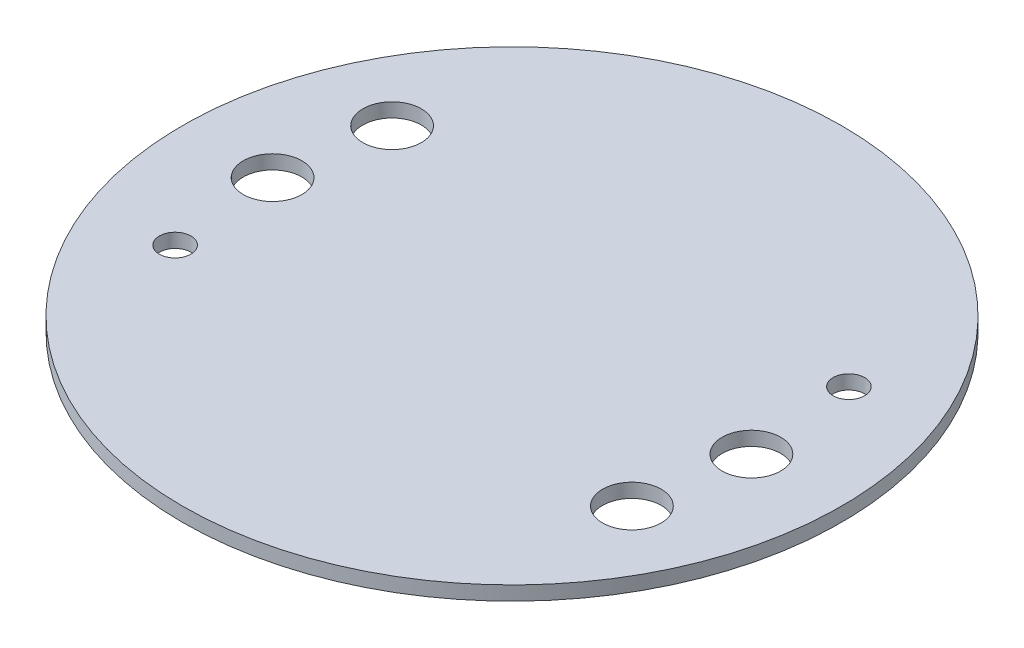
ISO-10303-21;
HEADER;
FILE_DESCRIPTION(('STEP AP214'),'2;1');
FILE_NAME('part.step','',(''),(''),'','','');
FILE_SCHEMA(('AUTOMOTIVE_DESIGN { 1 0 10303 214 1 1 1 1 }'));
ENDSEC;
DATA;
#1=APPLICATION_CONTEXT('core data for automotive mechanical design processes');
#2=APPLICATION_PROTOCOL_DEFINITION('international standard','automotive_design',2000,#1);
#3=PRODUCT_CONTEXT('',#1,'mechanical');
#4=PRODUCT('Part','Part','',(#3));
#5=PRODUCT_RELATED_PRODUCT_CATEGORY('part','',(#4));
#6=PRODUCT_DEFINITION_FORMATION('','',#4);
#7=PRODUCT_DEFINITION_CONTEXT('part definition',#1,'design');
#8=PRODUCT_DEFINITION('design','',#6,#7);
#9=PRODUCT_DEFINITION_SHAPE('','',#8);
#10=(LENGTH_UNIT() NAMED_UNIT(*) SI_UNIT(.MILLI.,.METRE.));
#11=(NAMED_UNIT(*) PLANE_ANGLE_UNIT() SI_UNIT($,.RADIAN.));
#12=(NAMED_UNIT(*) SI_UNIT($,.STERADIAN.) SOLID_ANGLE_UNIT());
#13=UNCERTAINTY_MEASURE_WITH_UNIT(LENGTH_MEASURE(1.E-05),#10,'distance_accuracy_value','');
#14=(GEOMETRIC_REPRESENTATION_CONTEXT(3) GLOBAL_UNCERTAINTY_ASSIGNED_CONTEXT((#13)) GLOBAL_UNIT_ASSIGNED_CONTEXT((#10,
#11,#12)) REPRESENTATION_CONTEXT('',''));
#15=CARTESIAN_POINT('',(0.,0.,0.));
#16=DIRECTION('',(0.,0.,1.));
#17=DIRECTION('',(1.,0.,0.));
#18=AXIS2_PLACEMENT_3D('',#15,#16,#17);
#19=CARTESIAN_POINT('',(0.,3.175,0.));
#20=DIRECTION('',(0.,-1.,0.));
#21=DIRECTION('',(0.,0.,-1.));
#22=AXIS2_PLACEMENT_3D('',#19,#20,#21);
#23=CYLINDRICAL_SURFACE('',#22,74.295);
#24=CARTESIAN_POINT('',(0.,3.175,0.));
#25=DIRECTION('',(0.,1.,0.));
#26=DIRECTION('',(0.,0.,1.));
#27=AXIS2_PLACEMENT_3D('',#24,#25,#26);
#28=CIRCLE('',#27,74.295);
#29=CARTESIAN_POINT('',(0.,3.175,74.295));
#30=VERTEX_POINT('',#29);
#31=EDGE_CURVE('E10',#30,#30,#28,.T.);
#32=ORIENTED_EDGE('',*,*,#31,.F.);
#33=EDGE_LOOP('',(#32));
#34=FACE_BOUND('',#33,.T.);
#35=CARTESIAN_POINT('',(0.,0.,0.));
#36=DIRECTION('',(0.,1.,0.));
#37=DIRECTION('',(0.,0.,1.));
#38=AXIS2_PLACEMENT_3D('',#35,#36,#37);
#39=CIRCLE('',#38,74.295);
#40=CARTESIAN_POINT('',(0.,0.,74.295));
#41=VERTEX_POINT('',#40);
#42=EDGE_CURVE('E41',#41,#41,#39,.T.);
#43=ORIENTED_EDGE('',*,*,#42,.T.);
#44=EDGE_LOOP('',(#43));
#45=FACE_BOUND('',#44,.T.);
#46=ADVANCED_FACE('F38',(#34,#45),#23,.T.);
#47=CARTESIAN_POINT('',(0.,3.175,0.));
#48=DIRECTION('',(0.,1.,0.));
#49=DIRECTION('',(0.,0.,1.));
#50=AXIS2_PLACEMENT_3D('',#47,#48,#49);
#51=PLANE('',#50);
#52=CARTESIAN_POINT('',(50.644479139608,3.175,23.6159084660704));
#53=DIRECTION('',(0.,1.,0.));
#54=DIRECTION('',(0.,0.,1.));
#55=AXIS2_PLACEMENT_3D('',#52,#53,#54);
#56=CIRCLE('',#55,6.604);
#57=CARTESIAN_POINT('',(50.644479139608,3.175,30.2199084660704));
#58=VERTEX_POINT('',#57);
#59=EDGE_CURVE('E71',#58,#58,#56,.T.);
#60=ORIENTED_EDGE('',*,*,#59,.F.);
#61=EDGE_LOOP('',(#60));
#62=FACE_BOUND('',#61,.T.);
#63=CARTESIAN_POINT('',(51.7954900291446,3.175,-24.152633658481));
#64=DIRECTION('',(0.,1.,0.));
#65=DIRECTION('',(0.,0.,1.));
#66=AXIS2_PLACEMENT_3D('',#63,#64,#65);
#67=CIRCLE('',#66,3.55600000000001);
#68=CARTESIAN_POINT('',(51.7954900291446,3.175,-20.596633658481));
#69=VERTEX_POINT('',#68);
#70=EDGE_CURVE('E60',#69,#69,#67,.T.);
#71=ORIENTED_EDGE('',*,*,#70,.F.);
#72=EDGE_LOOP('',(#71));
#73=FACE_BOUND('',#72,.T.);
#74=CARTESIAN_POINT('',(53.975,3.175,0.));
#75=DIRECTION('',(0.,1.,0.));
#76=DIRECTION('',(0.,0.,1.));
#77=AXIS2_PLACEMENT_3D('',#74,#75,#76);
#78=CIRCLE('',#77,6.604);
#79=CARTESIAN_POINT('',(53.975,3.175,6.60399999999998));
#80=VERTEX_POINT('',#79);
#81=EDGE_CURVE('E59',#80,#80,#78,.T.);
#82=ORIENTED_EDGE('',*,*,#81,.F.);
#83=EDGE_LOOP('',(#82));
#84=FACE_BOUND('',#83,.T.);
#85=CARTESIAN_POINT('',(-53.975,3.175,0.));
#86=DIRECTION('',(0.,1.,0.));
#87=DIRECTION('',(0.,0.,1.));
#88=AXIS2_PLACEMENT_3D('',#85,#86,#87);
#89=CIRCLE('',#88,6.604);
#90=CARTESIAN_POINT('',(-53.975,3.175,6.60400000000001));
#91=VERTEX_POINT('',#90);
#92=EDGE_CURVE('E53',#91,#91,#89,.T.);
#93=ORIENTED_EDGE('',*,*,#92,.F.);
#94=EDGE_LOOP('',(#93));
#95=FACE_BOUND('',#94,.T.);
#96=CARTESIAN_POINT('',(-50.644479139608,3.175,-23.6159084660703));
#97=DIRECTION('',(0.,1.,0.));
#98=DIRECTION('',(0.,0.,1.));
#99=AXIS2_PLACEMENT_3D('',#96,#97,#98);
#100=CIRCLE('',#99,6.604);
#101=CARTESIAN_POINT('',(-50.644479139608,3.175,-17.0119084660703));
#102=VERTEX_POINT('',#101);
#103=EDGE_CURVE('E72',#102,#102,#100,.T.);
#104=ORIENTED_EDGE('',*,*,#103,.F.);
#105=EDGE_LOOP('',(#104));
#106=FACE_BOUND('',#105,.T.);
#107=CARTESIAN_POINT('',(-51.7954900291446,3.175,24.1526336584811));
#108=DIRECTION('',(0.,1.,0.));
#109=DIRECTION('',(0.,0.,1.));
#110=AXIS2_PLACEMENT_3D('',#107,#108,#109);
#111=CIRCLE('',#110,3.55600000000001);
#112=CARTESIAN_POINT('',(-51.7954900291446,3.175,27.7086336584811));
#113=VERTEX_POINT('',#112);
#114=EDGE_CURVE('E50',#113,#113,#111,.T.);
#115=ORIENTED_EDGE('',*,*,#114,.F.);
#116=EDGE_LOOP('',(#115));
#117=FACE_BOUND('',#116,.T.);
#118=ORIENTED_EDGE('',*,*,#31,.T.);
#119=EDGE_LOOP('',(#118));
#120=FACE_BOUND('',#119,.T.);
#121=ADVANCED_FACE('F88',(#62,#73,#84,#95,#106,#117,#120),#51,.T.);
#122=CARTESIAN_POINT('',(0.,0.,0.));
#123=DIRECTION('',(0.,1.,0.));
#124=DIRECTION('',(0.,0.,1.));
#125=AXIS2_PLACEMENT_3D('',#122,#123,#124);
#126=PLANE('',#125);
#127=CARTESIAN_POINT('',(50.644479139608,0.,23.6159084660704));
#128=DIRECTION('',(0.,1.,0.));
#129=DIRECTION('',(0.,0.,1.));
#130=AXIS2_PLACEMENT_3D('',#127,#128,#129);
#131=CIRCLE('',#130,6.604);
#132=CARTESIAN_POINT('',(50.644479139608,0.,30.2199084660704));
#133=VERTEX_POINT('',#132);
#134=EDGE_CURVE('E68',#133,#133,#131,.T.);
#135=ORIENTED_EDGE('',*,*,#134,.T.);
#136=EDGE_LOOP('',(#135));
#137=FACE_BOUND('',#136,.T.);
#138=CARTESIAN_POINT('',(51.7954900291446,0.,-24.152633658481));
#139=DIRECTION('',(0.,1.,0.));
#140=DIRECTION('',(0.,0.,1.));
#141=AXIS2_PLACEMENT_3D('',#138,#139,#140);
#142=CIRCLE('',#141,3.55600000000001);
#143=CARTESIAN_POINT('',(51.7954900291446,0.,-20.596633658481));
#144=VERTEX_POINT('',#143);
#145=EDGE_CURVE('E75',#144,#144,#142,.T.);
#146=ORIENTED_EDGE('',*,*,#145,.T.);
#147=EDGE_LOOP('',(#146));
#148=FACE_BOUND('',#147,.T.);
#149=CARTESIAN_POINT('',(53.975,0.,0.));
#150=DIRECTION('',(0.,1.,0.));
#151=DIRECTION('',(0.,0.,1.));
#152=AXIS2_PLACEMENT_3D('',#149,#150,#151);
#153=CIRCLE('',#152,6.604);
#154=CARTESIAN_POINT('',(53.975,0.,6.60399999999998));
#155=VERTEX_POINT('',#154);
#156=EDGE_CURVE('E56',#155,#155,#153,.T.);
#157=ORIENTED_EDGE('',*,*,#156,.T.);
#158=EDGE_LOOP('',(#157));
#159=FACE_BOUND('',#158,.T.);
#160=CARTESIAN_POINT('',(-53.975,0.,0.));
#161=DIRECTION('',(0.,1.,0.));
#162=DIRECTION('',(0.,0.,1.));
#163=AXIS2_PLACEMENT_3D('',#160,#161,#162);
#164=CIRCLE('',#163,6.604);
#165=CARTESIAN_POINT('',(-53.975,0.,6.60400000000001));
#166=VERTEX_POINT('',#165);
#167=EDGE_CURVE('E63',#166,#166,#164,.T.);
#168=ORIENTED_EDGE('',*,*,#167,.T.);
#169=EDGE_LOOP('',(#168));
#170=FACE_BOUND('',#169,.T.);
#171=CARTESIAN_POINT('',(-50.644479139608,0.,-23.6159084660703));
#172=DIRECTION('',(0.,1.,0.));
#173=DIRECTION('',(0.,0.,1.));
#174=AXIS2_PLACEMENT_3D('',#171,#172,#173);
#175=CIRCLE('',#174,6.604);
#176=CARTESIAN_POINT('',(-50.644479139608,0.,-17.0119084660703));
#177=VERTEX_POINT('',#176);
#178=EDGE_CURVE('E80',#177,#177,#175,.T.);
#179=ORIENTED_EDGE('',*,*,#178,.T.);
#180=EDGE_LOOP('',(#179));
#181=FACE_BOUND('',#180,.T.);
#182=CARTESIAN_POINT('',(-51.7954900291446,0.,24.1526336584811));
#183=DIRECTION('',(0.,1.,0.));
#184=DIRECTION('',(0.,0.,1.));
#185=AXIS2_PLACEMENT_3D('',#182,#183,#184);
#186=CIRCLE('',#185,3.55600000000001);
#187=CARTESIAN_POINT('',(-51.7954900291446,0.,27.7086336584811));
#188=VERTEX_POINT('',#187);
#189=EDGE_CURVE('E48',#188,#188,#186,.T.);
#190=ORIENTED_EDGE('',*,*,#189,.T.);
#191=EDGE_LOOP('',(#190));
#192=FACE_BOUND('',#191,.T.);
#193=ORIENTED_EDGE('',*,*,#42,.F.);
#194=EDGE_LOOP('',(#193));
#195=FACE_BOUND('',#194,.T.);
#196=ADVANCED_FACE('F91',(#137,#148,#159,#170,#181,#192,#195),#126,.F.);
#197=CARTESIAN_POINT('',(-51.7954900291446,0.,24.1526336584811));
#198=DIRECTION('',(0.,1.,0.));
#199=DIRECTION('',(0.,0.,1.));
#200=AXIS2_PLACEMENT_3D('',#197,#198,#199);
#201=CYLINDRICAL_SURFACE('',#200,3.55600000000001);
#202=ORIENTED_EDGE('',*,*,#189,.F.);
#203=EDGE_LOOP('',(#202));
#204=FACE_BOUND('',#203,.T.);
#205=ORIENTED_EDGE('',*,*,#114,.T.);
#206=EDGE_LOOP('',(#205));
#207=FACE_BOUND('',#206,.T.);
#208=ADVANCED_FACE('F96',(#204,#207),#201,.F.);
#209=CARTESIAN_POINT('',(-50.644479139608,0.,-23.6159084660703));
#210=DIRECTION('',(0.,1.,0.));
#211=DIRECTION('',(0.,0.,1.));
#212=AXIS2_PLACEMENT_3D('',#209,#210,#211);
#213=CYLINDRICAL_SURFACE('',#212,6.604);
#214=ORIENTED_EDGE('',*,*,#178,.F.);
#215=EDGE_LOOP('',(#214));
#216=FACE_BOUND('',#215,.T.);
#217=ORIENTED_EDGE('',*,*,#103,.T.);
#218=EDGE_LOOP('',(#217));
#219=FACE_BOUND('',#218,.T.);
#220=ADVANCED_FACE('F86',(#216,#219),#213,.F.);
#221=CARTESIAN_POINT('',(-53.975,0.,0.));
#222=DIRECTION('',(0.,1.,0.));
#223=DIRECTION('',(0.,0.,1.));
#224=AXIS2_PLACEMENT_3D('',#221,#222,#223);
#225=CYLINDRICAL_SURFACE('',#224,6.604);
#226=ORIENTED_EDGE('',*,*,#167,.F.);
#227=EDGE_LOOP('',(#226));
#228=FACE_BOUND('',#227,.T.);
#229=ORIENTED_EDGE('',*,*,#92,.T.);
#230=EDGE_LOOP('',(#229));
#231=FACE_BOUND('',#230,.T.);
#232=ADVANCED_FACE('F104',(#228,#231),#225,.F.);
#233=CARTESIAN_POINT('',(53.975,0.,0.));
#234=DIRECTION('',(0.,1.,0.));
#235=DIRECTION('',(0.,0.,1.));
#236=AXIS2_PLACEMENT_3D('',#233,#234,#235);
#237=CYLINDRICAL_SURFACE('',#236,6.604);
#238=ORIENTED_EDGE('',*,*,#156,.F.);
#239=EDGE_LOOP('',(#238));
#240=FACE_BOUND('',#239,.T.);
#241=ORIENTED_EDGE('',*,*,#81,.T.);
#242=EDGE_LOOP('',(#241));
#243=FACE_BOUND('',#242,.T.);
#244=ADVANCED_FACE('F147',(#240,#243),#237,.F.);
#245=CARTESIAN_POINT('',(51.7954900291446,0.,-24.152633658481));
#246=DIRECTION('',(0.,1.,0.));
#247=DIRECTION('',(0.,0.,1.));
#248=AXIS2_PLACEMENT_3D('',#245,#246,#247);
#249=CYLINDRICAL_SURFACE('',#248,3.55600000000001);
#250=ORIENTED_EDGE('',*,*,#145,.F.);
#251=EDGE_LOOP('',(#250));
#252=FACE_BOUND('',#251,.T.);
#253=ORIENTED_EDGE('',*,*,#70,.T.);
#254=EDGE_LOOP('',(#253));
#255=FACE_BOUND('',#254,.T.);
#256=ADVANCED_FACE('F157',(#252,#255),#249,.F.);
#257=CARTESIAN_POINT('',(50.644479139608,0.,23.6159084660704));
#258=DIRECTION('',(0.,1.,0.));
#259=DIRECTION('',(0.,0.,1.));
#260=AXIS2_PLACEMENT_3D('',#257,#258,#259);
#261=CYLINDRICAL_SURFACE('',#260,6.604);
#262=ORIENTED_EDGE('',*,*,#134,.F.);
#263=EDGE_LOOP('',(#262));
#264=FACE_BOUND('',#263,.T.);
#265=ORIENTED_EDGE('',*,*,#59,.T.);
#266=EDGE_LOOP('',(#265));
#267=FACE_BOUND('',#266,.T.);
#268=ADVANCED_FACE('F166',(#264,#267),#261,.F.);
#269=CLOSED_SHELL('',(#46,#121,#196,#208,#220,#232,#244,#256,#268));
#270=MANIFOLD_SOLID_BREP('B2',#269);
#271=ADVANCED_BREP_SHAPE_REPRESENTATION('',(#18,#270),#14);
#272=SHAPE_DEFINITION_REPRESENTATION(#9,#271);
ENDSEC;
END-ISO-10303-21;
